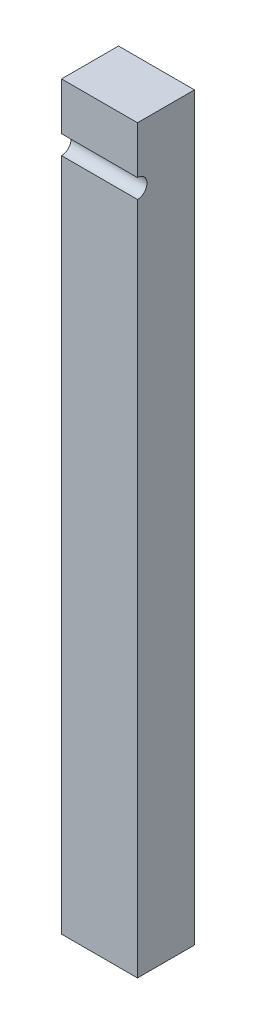
ISO-10303-21;
HEADER;
FILE_DESCRIPTION(('STEP AP214'),'2;1');
FILE_NAME('part.step','',(''),(''),'','','');
FILE_SCHEMA(('AUTOMOTIVE_DESIGN { 1 0 10303 214 1 1 1 1 }'));
ENDSEC;
DATA;
#1=APPLICATION_CONTEXT('core data for automotive mechanical design processes');
#2=APPLICATION_PROTOCOL_DEFINITION('international standard','automotive_design',2000,#1);
#3=PRODUCT_CONTEXT('',#1,'mechanical');
#4=PRODUCT('Part','Part','',(#3));
#5=PRODUCT_RELATED_PRODUCT_CATEGORY('part','',(#4));
#6=PRODUCT_DEFINITION_FORMATION('','',#4);
#7=PRODUCT_DEFINITION_CONTEXT('part definition',#1,'design');
#8=PRODUCT_DEFINITION('design','',#6,#7);
#9=PRODUCT_DEFINITION_SHAPE('','',#8);
#10=(LENGTH_UNIT() NAMED_UNIT(*) SI_UNIT(.MILLI.,.METRE.));
#11=(NAMED_UNIT(*) PLANE_ANGLE_UNIT() SI_UNIT($,.RADIAN.));
#12=(NAMED_UNIT(*) SI_UNIT($,.STERADIAN.) SOLID_ANGLE_UNIT());
#13=UNCERTAINTY_MEASURE_WITH_UNIT(LENGTH_MEASURE(1.E-05),#10,'distance_accuracy_value','');
#14=(GEOMETRIC_REPRESENTATION_CONTEXT(3) GLOBAL_UNCERTAINTY_ASSIGNED_CONTEXT((#13)) GLOBAL_UNIT_ASSIGNED_CONTEXT((#10,
#11,#12)) REPRESENTATION_CONTEXT('',''));
#15=CARTESIAN_POINT('',(0.,0.,0.));
#16=DIRECTION('',(0.,0.,1.));
#17=DIRECTION('',(1.,0.,0.));
#18=AXIS2_PLACEMENT_3D('',#15,#16,#17);
#19=CARTESIAN_POINT('',(0.,990.6,0.));
#20=DIRECTION('',(0.,0.,-1.));
#21=DIRECTION('',(-1.,0.,0.));
#22=AXIS2_PLACEMENT_3D('',#19,#20,#21);
#23=PLANE('',#22);
#24=DIRECTION('',(0.,-1.,0.));
#25=VECTOR('',#24,1.);
#26=CARTESIAN_POINT('',(0.,990.6,0.));
#27=LINE('',#26,#25);
#28=CARTESIAN_POINT('',(0.,990.6,0.));
#29=VERTEX_POINT('',#28);
#30=CARTESIAN_POINT('',(0.,927.1,0.));
#31=VERTEX_POINT('',#30);
#32=EDGE_CURVE('E41',#29,#31,#27,.T.);
#33=ORIENTED_EDGE('',*,*,#32,.T.);
#34=DIRECTION('',(1.,0.,0.));
#35=VECTOR('',#34,1.);
#36=CARTESIAN_POINT('',(0.,927.1,0.));
#37=LINE('',#36,#35);
#38=CARTESIAN_POINT('',(101.6,927.1,0.));
#39=VERTEX_POINT('',#38);
#40=EDGE_CURVE('E93',#31,#39,#37,.T.);
#41=ORIENTED_EDGE('',*,*,#40,.T.);
#42=DIRECTION('',(0.,-1.,0.));
#43=VECTOR('',#42,1.);
#44=CARTESIAN_POINT('',(101.6,990.6,0.));
#45=LINE('',#44,#43);
#46=CARTESIAN_POINT('',(101.6,990.6,0.));
#47=VERTEX_POINT('',#46);
#48=EDGE_CURVE('E107',#47,#39,#45,.T.);
#49=ORIENTED_EDGE('',*,*,#48,.F.);
#50=DIRECTION('',(1.,0.,0.));
#51=VECTOR('',#50,1.);
#52=CARTESIAN_POINT('',(0.,990.6,0.));
#53=LINE('',#52,#51);
#54=EDGE_CURVE('E85',#29,#47,#53,.T.);
#55=ORIENTED_EDGE('',*,*,#54,.F.);
#56=EDGE_LOOP('',(#33,#41,#49,#55));
#57=FACE_BOUND('',#56,.T.);
#58=ADVANCED_FACE('F33',(#57),#23,.F.);
#59=CARTESIAN_POINT('',(0.,990.6,0.));
#60=DIRECTION('',(1.,0.,0.));
#61=DIRECTION('',(0.,0.,-1.));
#62=AXIS2_PLACEMENT_3D('',#59,#60,#61);
#63=PLANE('',#62);
#64=CARTESIAN_POINT('',(0.,901.7,0.));
#65=VERTEX_POINT('',#64);
#66=CARTESIAN_POINT('',(0.,0.,0.));
#67=VERTEX_POINT('',#66);
#68=EDGE_CURVE('E105',#65,#67,#27,.T.);
#69=ORIENTED_EDGE('',*,*,#68,.F.);
#70=CARTESIAN_POINT('',(0.,914.4,0.));
#71=DIRECTION('',(1.,0.,0.));
#72=DIRECTION('',(0.,0.,-1.));
#73=AXIS2_PLACEMENT_3D('',#70,#71,#72);
#74=CIRCLE('',#73,12.7);
#75=EDGE_CURVE('E96',#65,#31,#74,.T.);
#76=ORIENTED_EDGE('',*,*,#75,.T.);
#77=ORIENTED_EDGE('',*,*,#32,.F.);
#78=DIRECTION('',(0.,0.,1.));
#79=VECTOR('',#78,1.);
#80=CARTESIAN_POINT('',(0.,990.6,0.));
#81=LINE('',#80,#79);
#82=CARTESIAN_POINT('',(0.,990.6,-76.2));
#83=VERTEX_POINT('',#82);
#84=EDGE_CURVE('E116',#83,#29,#81,.T.);
#85=ORIENTED_EDGE('',*,*,#84,.F.);
#86=DIRECTION('',(0.,-1.,0.));
#87=VECTOR('',#86,1.);
#88=CARTESIAN_POINT('',(0.,990.6,-76.2));
#89=LINE('',#88,#87);
#90=CARTESIAN_POINT('',(0.,0.,-76.2));
#91=VERTEX_POINT('',#90);
#92=EDGE_CURVE('E113',#83,#91,#89,.T.);
#93=ORIENTED_EDGE('',*,*,#92,.T.);
#94=DIRECTION('',(0.,0.,1.));
#95=VECTOR('',#94,1.);
#96=CARTESIAN_POINT('',(0.,0.,0.));
#97=LINE('',#96,#95);
#98=EDGE_CURVE('E98',#91,#67,#97,.T.);
#99=ORIENTED_EDGE('',*,*,#98,.T.);
#100=EDGE_LOOP('',(#69,#76,#77,#85,#93,#99));
#101=FACE_BOUND('',#100,.T.);
#102=ADVANCED_FACE('F35',(#101),#63,.F.);
#103=CARTESIAN_POINT('',(101.6,901.7,0.));
#104=VERTEX_POINT('',#103);
#105=CARTESIAN_POINT('',(101.6,0.,0.));
#106=VERTEX_POINT('',#105);
#107=EDGE_CURVE('E110',#104,#106,#45,.T.);
#108=ORIENTED_EDGE('',*,*,#107,.F.);
#109=DIRECTION('',(1.,0.,0.));
#110=VECTOR('',#109,1.);
#111=CARTESIAN_POINT('',(0.,901.7,0.));
#112=LINE('',#111,#110);
#113=EDGE_CURVE('E48',#104,#65,#112,.F.);
#114=ORIENTED_EDGE('',*,*,#113,.T.);
#115=ORIENTED_EDGE('',*,*,#68,.T.);
#116=DIRECTION('',(1.,0.,0.));
#117=VECTOR('',#116,1.);
#118=CARTESIAN_POINT('',(0.,0.,0.));
#119=LINE('',#118,#117);
#120=EDGE_CURVE('E119',#67,#106,#119,.T.);
#121=ORIENTED_EDGE('',*,*,#120,.T.);
#122=EDGE_LOOP('',(#108,#114,#115,#121));
#123=FACE_BOUND('',#122,.T.);
#124=ADVANCED_FACE('F130',(#123),#23,.F.);
#125=CARTESIAN_POINT('',(101.6,990.6,0.));
#126=DIRECTION('',(-1.,0.,0.));
#127=DIRECTION('',(0.,0.,1.));
#128=AXIS2_PLACEMENT_3D('',#125,#126,#127);
#129=PLANE('',#128);
#130=ORIENTED_EDGE('',*,*,#48,.T.);
#131=CARTESIAN_POINT('',(101.6,914.4,0.));
#132=DIRECTION('',(-1.,0.,0.));
#133=DIRECTION('',(0.,0.,1.));
#134=AXIS2_PLACEMENT_3D('',#131,#132,#133);
#135=CIRCLE('',#134,12.7);
#136=EDGE_CURVE('E11',#39,#104,#135,.T.);
#137=ORIENTED_EDGE('',*,*,#136,.T.);
#138=ORIENTED_EDGE('',*,*,#107,.T.);
#139=DIRECTION('',(0.,0.,-1.));
#140=VECTOR('',#139,1.);
#141=CARTESIAN_POINT('',(101.6,0.,0.));
#142=LINE('',#141,#140);
#143=CARTESIAN_POINT('',(101.6,0.,-76.2));
#144=VERTEX_POINT('',#143);
#145=EDGE_CURVE('E117',#106,#144,#142,.T.);
#146=ORIENTED_EDGE('',*,*,#145,.T.);
#147=DIRECTION('',(0.,-1.,0.));
#148=VECTOR('',#147,1.);
#149=CARTESIAN_POINT('',(101.6,990.6,-76.2));
#150=LINE('',#149,#148);
#151=CARTESIAN_POINT('',(101.6,990.6,-76.2));
#152=VERTEX_POINT('',#151);
#153=EDGE_CURVE('E111',#152,#144,#150,.T.);
#154=ORIENTED_EDGE('',*,*,#153,.F.);
#155=DIRECTION('',(0.,0.,-1.));
#156=VECTOR('',#155,1.);
#157=CARTESIAN_POINT('',(101.6,990.6,0.));
#158=LINE('',#157,#156);
#159=EDGE_CURVE('E124',#47,#152,#158,.T.);
#160=ORIENTED_EDGE('',*,*,#159,.F.);
#161=EDGE_LOOP('',(#130,#137,#138,#146,#154,#160));
#162=FACE_BOUND('',#161,.T.);
#163=ADVANCED_FACE('F134',(#162),#129,.F.);
#164=CARTESIAN_POINT('',(0.,990.6,-76.2));
#165=DIRECTION('',(0.,0.,1.));
#166=DIRECTION('',(1.,0.,0.));
#167=AXIS2_PLACEMENT_3D('',#164,#165,#166);
#168=PLANE('',#167);
#169=DIRECTION('',(-1.,0.,0.));
#170=VECTOR('',#169,1.);
#171=CARTESIAN_POINT('',(0.,0.,-76.2));
#172=LINE('',#171,#170);
#173=EDGE_CURVE('E77',#144,#91,#172,.T.);
#174=ORIENTED_EDGE('',*,*,#173,.T.);
#175=ORIENTED_EDGE('',*,*,#92,.F.);
#176=DIRECTION('',(-1.,0.,0.));
#177=VECTOR('',#176,1.);
#178=CARTESIAN_POINT('',(0.,990.6,-76.2));
#179=LINE('',#178,#177);
#180=EDGE_CURVE('E56',#152,#83,#179,.T.);
#181=ORIENTED_EDGE('',*,*,#180,.F.);
#182=ORIENTED_EDGE('',*,*,#153,.T.);
#183=EDGE_LOOP('',(#174,#175,#181,#182));
#184=FACE_BOUND('',#183,.T.);
#185=ADVANCED_FACE('F148',(#184),#168,.F.);
#186=CARTESIAN_POINT('',(0.,990.6,0.));
#187=DIRECTION('',(0.,-1.,0.));
#188=DIRECTION('',(0.,0.,-1.));
#189=AXIS2_PLACEMENT_3D('',#186,#187,#188);
#190=PLANE('',#189);
#191=ORIENTED_EDGE('',*,*,#84,.T.);
#192=ORIENTED_EDGE('',*,*,#54,.T.);
#193=ORIENTED_EDGE('',*,*,#159,.T.);
#194=ORIENTED_EDGE('',*,*,#180,.T.);
#195=EDGE_LOOP('',(#191,#192,#193,#194));
#196=FACE_BOUND('',#195,.T.);
#197=ADVANCED_FACE('F137',(#196),#190,.F.);
#198=CARTESIAN_POINT('',(0.,0.,0.));
#199=DIRECTION('',(0.,-1.,0.));
#200=DIRECTION('',(0.,0.,-1.));
#201=AXIS2_PLACEMENT_3D('',#198,#199,#200);
#202=PLANE('',#201);
#203=ORIENTED_EDGE('',*,*,#98,.F.);
#204=ORIENTED_EDGE('',*,*,#173,.F.);
#205=ORIENTED_EDGE('',*,*,#145,.F.);
#206=ORIENTED_EDGE('',*,*,#120,.F.);
#207=EDGE_LOOP('',(#203,#204,#205,#206));
#208=FACE_BOUND('',#207,.T.);
#209=ADVANCED_FACE('F140',(#208),#202,.T.);
#210=CARTESIAN_POINT('',(0.,914.4,0.));
#211=DIRECTION('',(1.,0.,0.));
#212=DIRECTION('',(0.,0.,-1.));
#213=AXIS2_PLACEMENT_3D('',#210,#211,#212);
#214=CYLINDRICAL_SURFACE('',#213,12.7);
#215=ORIENTED_EDGE('',*,*,#75,.F.);
#216=ORIENTED_EDGE('',*,*,#113,.F.);
#217=ORIENTED_EDGE('',*,*,#136,.F.);
#218=ORIENTED_EDGE('',*,*,#40,.F.);
#219=EDGE_LOOP('',(#215,#216,#217,#218));
#220=FACE_BOUND('',#219,.T.);
#221=ADVANCED_FACE('F95',(#220),#214,.F.);
#222=CLOSED_SHELL('',(#58,#102,#124,#163,#185,#197,#209,#221));
#223=MANIFOLD_SOLID_BREP('B2',#222);
#224=ADVANCED_BREP_SHAPE_REPRESENTATION('',(#18,#223),#14);
#225=SHAPE_DEFINITION_REPRESENTATION(#9,#224);
ENDSEC;
END-ISO-10303-21;
